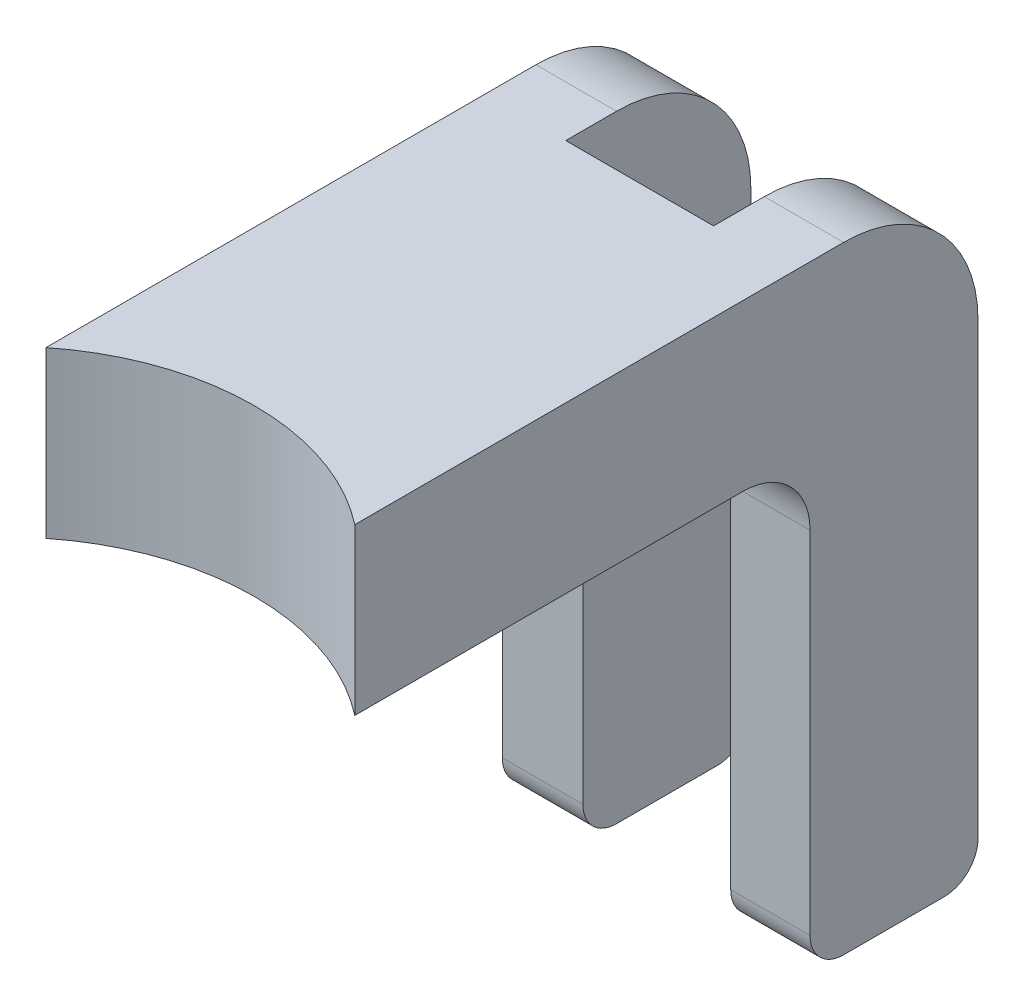
ISO-10303-21;
HEADER;
FILE_DESCRIPTION(('STEP AP214'),'2;1');
FILE_NAME('part.step','',(''),(''),'','','');
FILE_SCHEMA(('AUTOMOTIVE_DESIGN { 1 0 10303 214 1 1 1 1 }'));
ENDSEC;
DATA;
#1=APPLICATION_CONTEXT('core data for automotive mechanical design processes');
#2=APPLICATION_PROTOCOL_DEFINITION('international standard','automotive_design',2000,#1);
#3=PRODUCT_CONTEXT('',#1,'mechanical');
#4=PRODUCT('Part','Part','',(#3));
#5=PRODUCT_RELATED_PRODUCT_CATEGORY('part','',(#4));
#6=PRODUCT_DEFINITION_FORMATION('','',#4);
#7=PRODUCT_DEFINITION_CONTEXT('part definition',#1,'design');
#8=PRODUCT_DEFINITION('design','',#6,#7);
#9=PRODUCT_DEFINITION_SHAPE('','',#8);
#10=(LENGTH_UNIT() NAMED_UNIT(*) SI_UNIT(.MILLI.,.METRE.));
#11=(NAMED_UNIT(*) PLANE_ANGLE_UNIT() SI_UNIT($,.RADIAN.));
#12=(NAMED_UNIT(*) SI_UNIT($,.STERADIAN.) SOLID_ANGLE_UNIT());
#13=UNCERTAINTY_MEASURE_WITH_UNIT(LENGTH_MEASURE(1.E-05),#10,'distance_accuracy_value','');
#14=(GEOMETRIC_REPRESENTATION_CONTEXT(3) GLOBAL_UNCERTAINTY_ASSIGNED_CONTEXT((#13)) GLOBAL_UNIT_ASSIGNED_CONTEXT((#10,
#11,#12)) REPRESENTATION_CONTEXT('',''));
#15=CARTESIAN_POINT('',(0.,0.,0.));
#16=DIRECTION('',(0.,0.,1.));
#17=DIRECTION('',(1.,0.,0.));
#18=AXIS2_PLACEMENT_3D('',#15,#16,#17);
#19=CARTESIAN_POINT('',(43.,0.,-3.68365272160217));
#20=DIRECTION('',(0.,-1.,0.));
#21=DIRECTION('',(0.,0.,-1.));
#22=AXIS2_PLACEMENT_3D('',#19,#20,#21);
#23=PLANE('',#22);
#24=DIRECTION('',(0.,0.,-1.));
#25=VECTOR('',#24,1.);
#26=CARTESIAN_POINT('',(-2.99661212960668,0.,-3.68365272160217));
#27=LINE('',#26,#25);
#28=CARTESIAN_POINT('',(-2.99661212960668,0.,8.78251286461066));
#29=VERTEX_POINT('',#28);
#30=CARTESIAN_POINT('',(-2.99661212960668,0.,-64.1321508343534));
#31=VERTEX_POINT('',#30);
#32=EDGE_CURVE('E44',#29,#31,#27,.T.);
#33=ORIENTED_EDGE('',*,*,#32,.F.);
#34=CARTESIAN_POINT('',(20.0033878782928,0.,37.7652663507207));
#35=DIRECTION('',(0.,-1.,0.));
#36=DIRECTION('',(0.,0.,-1.));
#37=AXIS2_PLACEMENT_3D('',#34,#35,#36);
#38=CIRCLE('',#37,37.);
#39=CARTESIAN_POINT('',(42.8033878703933,0.,8.62491631232517));
#40=VERTEX_POINT('',#39);
#41=EDGE_CURVE('E216',#40,#29,#38,.F.);
#42=ORIENTED_EDGE('',*,*,#41,.F.);
#43=DIRECTION('',(0.,0.,1.));
#44=VECTOR('',#43,1.);
#45=CARTESIAN_POINT('',(42.8033878703933,0.,-3.68365272160217));
#46=LINE('',#45,#44);
#47=CARTESIAN_POINT('',(42.8033878703933,0.,-64.1321508343534));
#48=VERTEX_POINT('',#47);
#49=EDGE_CURVE('E52',#48,#40,#46,.T.);
#50=ORIENTED_EDGE('',*,*,#49,.F.);
#51=DIRECTION('',(-1.,0.,0.));
#52=VECTOR('',#51,1.);
#53=CARTESIAN_POINT('',(43.,0.,-64.1321508343534));
#54=LINE('',#53,#52);
#55=CARTESIAN_POINT('',(31.,0.,-64.1321508343534));
#56=VERTEX_POINT('',#55);
#57=EDGE_CURVE('E180',#48,#56,#54,.T.);
#58=ORIENTED_EDGE('',*,*,#57,.T.);
#59=DIRECTION('',(0.,0.,1.));
#60=VECTOR('',#59,1.);
#61=CARTESIAN_POINT('',(31.,0.,-3.68365272160217));
#62=LINE('',#61,#60);
#63=CARTESIAN_POINT('',(31.,0.,-56.5775329625134));
#64=VERTEX_POINT('',#63);
#65=EDGE_CURVE('E271',#56,#64,#62,.T.);
#66=ORIENTED_EDGE('',*,*,#65,.T.);
#67=DIRECTION('',(-1.,0.,0.));
#68=VECTOR('',#67,1.);
#69=CARTESIAN_POINT('',(43.,0.,-56.5775329625134));
#70=LINE('',#69,#68);
#71=CARTESIAN_POINT('',(9.00000000000001,0.,-56.5775329625134));
#72=VERTEX_POINT('',#71);
#73=EDGE_CURVE('E273',#64,#72,#70,.T.);
#74=ORIENTED_EDGE('',*,*,#73,.T.);
#75=DIRECTION('',(0.,0.,-1.));
#76=VECTOR('',#75,1.);
#77=CARTESIAN_POINT('',(9.00000000000001,0.,-3.68365272160217));
#78=LINE('',#77,#76);
#79=CARTESIAN_POINT('',(9.00000000000001,0.,-64.1321508343534));
#80=VERTEX_POINT('',#79);
#81=EDGE_CURVE('E250',#72,#80,#78,.T.);
#82=ORIENTED_EDGE('',*,*,#81,.T.);
#83=EDGE_CURVE('E182',#80,#31,#54,.T.);
#84=ORIENTED_EDGE('',*,*,#83,.T.);
#85=EDGE_LOOP('',(#33,#42,#50,#58,#66,#74,#82,#84));
#86=FACE_BOUND('',#85,.T.);
#87=ADVANCED_FACE('F31',(#86),#23,.F.);
#88=CARTESIAN_POINT('',(43.,-24.5968877497724,-3.68365272160218));
#89=DIRECTION('',(0.,1.,0.));
#90=DIRECTION('',(0.,0.,1.));
#91=AXIS2_PLACEMENT_3D('',#88,#89,#90);
#92=PLANE('',#91);
#93=DIRECTION('',(0.,0.,1.));
#94=VECTOR('',#93,1.);
#95=CARTESIAN_POINT('',(-2.99661212960668,-24.5968877497724,-3.68365272160218));
#96=LINE('',#95,#94);
#97=CARTESIAN_POINT('',(-2.99661212960667,-24.5968877497724,-49.1321508343534));
#98=VERTEX_POINT('',#97);
#99=CARTESIAN_POINT('',(-2.99661212960668,-24.5968877497724,8.78251286461066));
#100=VERTEX_POINT('',#99);
#101=EDGE_CURVE('E314',#98,#100,#96,.T.);
#102=ORIENTED_EDGE('',*,*,#101,.F.);
#103=DIRECTION('',(-1.,0.,0.));
#104=VECTOR('',#103,1.);
#105=CARTESIAN_POINT('',(43.,-24.5968877497724,-49.1321508343534));
#106=LINE('',#105,#104);
#107=CARTESIAN_POINT('',(42.8033878703933,-24.5968877497724,-49.1321508343534));
#108=VERTEX_POINT('',#107);
#109=EDGE_CURVE('E200',#108,#98,#106,.T.);
#110=ORIENTED_EDGE('',*,*,#109,.F.);
#111=DIRECTION('',(0.,0.,-1.));
#112=VECTOR('',#111,1.);
#113=CARTESIAN_POINT('',(42.8033878703933,-24.5968877497724,-3.68365272160218));
#114=LINE('',#113,#112);
#115=CARTESIAN_POINT('',(42.8033878703933,-24.5968877497724,8.62491631232517));
#116=VERTEX_POINT('',#115);
#117=EDGE_CURVE('E319',#116,#108,#114,.T.);
#118=ORIENTED_EDGE('',*,*,#117,.F.);
#119=CARTESIAN_POINT('',(20.0033878782928,-24.5968877497724,37.7652663507207));
#120=DIRECTION('',(0.,1.,0.));
#121=DIRECTION('',(0.,0.,1.));
#122=AXIS2_PLACEMENT_3D('',#119,#120,#121);
#123=CIRCLE('',#122,37.);
#124=EDGE_CURVE('E210',#100,#116,#123,.F.);
#125=ORIENTED_EDGE('',*,*,#124,.F.);
#126=EDGE_LOOP('',(#102,#110,#118,#125));
#127=FACE_BOUND('',#126,.T.);
#128=ADVANCED_FACE('F356',(#127),#92,.F.);
#129=CARTESIAN_POINT('',(43.,-34.5968877497724,-49.1321508343534));
#130=DIRECTION('',(-1.,0.,0.));
#131=DIRECTION('',(0.,0.,1.));
#132=AXIS2_PLACEMENT_3D('',#129,#130,#131);
#133=CYLINDRICAL_SURFACE('',#132,10.);
#134=CARTESIAN_POINT('',(-2.99661212960667,-34.5968877497724,-49.1321508343534));
#135=DIRECTION('',(-1.,0.,0.));
#136=DIRECTION('',(0.,-1.,0.));
#137=AXIS2_PLACEMENT_3D('',#134,#135,#136);
#138=CIRCLE('',#137,10.);
#139=CARTESIAN_POINT('',(-2.99661212960667,-34.5968877497724,-59.1321508343534));
#140=VERTEX_POINT('',#139);
#141=EDGE_CURVE('E312',#140,#98,#138,.F.);
#142=ORIENTED_EDGE('',*,*,#141,.F.);
#143=DIRECTION('',(-1.,0.,0.));
#144=VECTOR('',#143,1.);
#145=CARTESIAN_POINT('',(43.,-34.5968877497724,-59.1321508343534));
#146=LINE('',#145,#144);
#147=CARTESIAN_POINT('',(9.00000000000001,-34.5968877497724,-59.1321508343534));
#148=VERTEX_POINT('',#147);
#149=EDGE_CURVE('E197',#148,#140,#146,.T.);
#150=ORIENTED_EDGE('',*,*,#149,.F.);
#151=CARTESIAN_POINT('',(9.00000000000001,-34.5968877497724,-49.1321508343534));
#152=DIRECTION('',(-1.,0.,0.));
#153=DIRECTION('',(0.,0.,1.));
#154=AXIS2_PLACEMENT_3D('',#151,#152,#153);
#155=CIRCLE('',#154,10.);
#156=CARTESIAN_POINT('',(9.00000000000001,-27.9210892982255,-56.5775329625134));
#157=VERTEX_POINT('',#156);
#158=EDGE_CURVE('E247',#148,#157,#155,.F.);
#159=ORIENTED_EDGE('',*,*,#158,.T.);
#160=DIRECTION('',(-1.,0.,0.));
#161=VECTOR('',#160,1.);
#162=CARTESIAN_POINT('',(43.,-27.9210892982255,-56.5775329625134));
#163=LINE('',#162,#161);
#164=CARTESIAN_POINT('',(31.,-27.9210892982255,-56.5775329625134));
#165=VERTEX_POINT('',#164);
#166=EDGE_CURVE('E207',#157,#165,#163,.F.);
#167=ORIENTED_EDGE('',*,*,#166,.T.);
#168=CARTESIAN_POINT('',(31.,-34.5968877497724,-49.1321508343534));
#169=DIRECTION('',(1.,0.,0.));
#170=DIRECTION('',(0.,0.,-1.));
#171=AXIS2_PLACEMENT_3D('',#168,#169,#170);
#172=CIRCLE('',#171,10.);
#173=CARTESIAN_POINT('',(31.,-34.5968877497724,-59.1321508343534));
#174=VERTEX_POINT('',#173);
#175=EDGE_CURVE('E268',#165,#174,#172,.F.);
#176=ORIENTED_EDGE('',*,*,#175,.T.);
#177=CARTESIAN_POINT('',(42.8033878703933,-34.5968877497724,-59.1321508343534));
#178=VERTEX_POINT('',#177);
#179=EDGE_CURVE('E198',#178,#174,#146,.T.);
#180=ORIENTED_EDGE('',*,*,#179,.F.);
#181=CARTESIAN_POINT('',(42.8033878703933,-34.5968877497724,-49.1321508343534));
#182=DIRECTION('',(1.,0.,0.));
#183=DIRECTION('',(0.,0.,-1.));
#184=AXIS2_PLACEMENT_3D('',#181,#182,#183);
#185=CIRCLE('',#184,10.);
#186=EDGE_CURVE('E322',#108,#178,#185,.F.);
#187=ORIENTED_EDGE('',*,*,#186,.F.);
#188=ORIENTED_EDGE('',*,*,#109,.T.);
#189=EDGE_LOOP('',(#142,#150,#159,#167,#176,#180,#187,#188));
#190=FACE_BOUND('',#189,.T.);
#191=ADVANCED_FACE('F283',(#190),#133,.F.);
#192=CARTESIAN_POINT('',(20.0033878782928,50.,37.7652663507207));
#193=DIRECTION('',(0.,-1.,0.));
#194=DIRECTION('',(0.,0.,-1.));
#195=AXIS2_PLACEMENT_3D('',#192,#193,#194);
#196=CYLINDRICAL_SURFACE('',#195,37.);
#197=ORIENTED_EDGE('',*,*,#41,.T.);
#198=DIRECTION('',(0.,-1.,0.));
#199=VECTOR('',#198,1.);
#200=CARTESIAN_POINT('',(-2.99661212960668,50.,8.78251286461066));
#201=LINE('',#200,#199);
#202=EDGE_CURVE('E317',#29,#100,#201,.T.);
#203=ORIENTED_EDGE('',*,*,#202,.T.);
#204=ORIENTED_EDGE('',*,*,#124,.T.);
#205=DIRECTION('',(0.,-1.,0.));
#206=VECTOR('',#205,1.);
#207=CARTESIAN_POINT('',(42.8033878703933,50.,8.62491631232517));
#208=LINE('',#207,#206);
#209=EDGE_CURVE('E38',#116,#40,#208,.F.);
#210=ORIENTED_EDGE('',*,*,#209,.T.);
#211=EDGE_LOOP('',(#197,#203,#204,#210));
#212=FACE_BOUND('',#211,.T.);
#213=ADVANCED_FACE('F214',(#212),#196,.F.);
#214=CARTESIAN_POINT('',(43.,-34.5968877497724,-59.1321508343534));
#215=DIRECTION('',(0.,0.,-1.));
#216=DIRECTION('',(0.,1.,0.));
#217=AXIS2_PLACEMENT_3D('',#214,#215,#216);
#218=PLANE('',#217);
#219=DIRECTION('',(0.,1.,0.));
#220=VECTOR('',#219,1.);
#221=CARTESIAN_POINT('',(-2.99661212960667,-34.5968877497724,-59.1321508343534));
#222=LINE('',#221,#220);
#223=CARTESIAN_POINT('',(-2.99661212960666,-86.83159597,-59.1321508343534));
#224=VERTEX_POINT('',#223);
#225=EDGE_CURVE('E292',#224,#140,#222,.T.);
#226=ORIENTED_EDGE('',*,*,#225,.F.);
#227=DIRECTION('',(-1.,0.,0.));
#228=VECTOR('',#227,1.);
#229=CARTESIAN_POINT('',(43.,-86.83159597,-59.1321508343534));
#230=LINE('',#229,#228);
#231=CARTESIAN_POINT('',(9.00000000000001,-86.83159597,-59.1321508343534));
#232=VERTEX_POINT('',#231);
#233=EDGE_CURVE('E194',#232,#224,#230,.T.);
#234=ORIENTED_EDGE('',*,*,#233,.F.);
#235=DIRECTION('',(0.,1.,0.));
#236=VECTOR('',#235,1.);
#237=CARTESIAN_POINT('',(9.00000000000001,-34.5968877497724,-59.1321508343534));
#238=LINE('',#237,#236);
#239=EDGE_CURVE('E244',#232,#148,#238,.T.);
#240=ORIENTED_EDGE('',*,*,#239,.T.);
#241=ORIENTED_EDGE('',*,*,#149,.T.);
#242=EDGE_LOOP('',(#226,#234,#240,#241));
#243=FACE_BOUND('',#242,.T.);
#244=ADVANCED_FACE('F290',(#243),#218,.F.);
#245=CARTESIAN_POINT('',(43.,-86.83159597,-64.1321508343534));
#246=DIRECTION('',(-1.,0.,0.));
#247=DIRECTION('',(0.,0.,1.));
#248=AXIS2_PLACEMENT_3D('',#245,#246,#247);
#249=CYLINDRICAL_SURFACE('',#248,5.00000000000001);
#250=CARTESIAN_POINT('',(-2.99661212960666,-86.83159597,-64.1321508343534));
#251=DIRECTION('',(-1.,0.,0.));
#252=DIRECTION('',(0.,-1.,0.));
#253=AXIS2_PLACEMENT_3D('',#250,#251,#252);
#254=CIRCLE('',#253,5.00000000000001);
#255=CARTESIAN_POINT('',(-2.99661212960666,-91.83159597,-64.1321508343534));
#256=VERTEX_POINT('',#255);
#257=EDGE_CURVE('E297',#256,#224,#254,.T.);
#258=ORIENTED_EDGE('',*,*,#257,.F.);
#259=DIRECTION('',(-1.,0.,0.));
#260=VECTOR('',#259,1.);
#261=CARTESIAN_POINT('',(43.,-91.83159597,-64.1321508343534));
#262=LINE('',#261,#260);
#263=CARTESIAN_POINT('',(9.00000000000001,-91.83159597,-64.1321508343534));
#264=VERTEX_POINT('',#263);
#265=EDGE_CURVE('E191',#264,#256,#262,.T.);
#266=ORIENTED_EDGE('',*,*,#265,.F.);
#267=CARTESIAN_POINT('',(9.00000000000001,-86.83159597,-64.1321508343534));
#268=DIRECTION('',(-1.,0.,0.));
#269=DIRECTION('',(0.,0.,1.));
#270=AXIS2_PLACEMENT_3D('',#267,#268,#269);
#271=CIRCLE('',#270,5.00000000000001);
#272=EDGE_CURVE('E241',#264,#232,#271,.T.);
#273=ORIENTED_EDGE('',*,*,#272,.T.);
#274=ORIENTED_EDGE('',*,*,#233,.T.);
#275=EDGE_LOOP('',(#258,#266,#273,#274));
#276=FACE_BOUND('',#275,.T.);
#277=ADVANCED_FACE('F295',(#276),#249,.T.);
#278=CARTESIAN_POINT('',(43.,-91.83159597,-64.1321508343534));
#279=DIRECTION('',(0.,1.,0.));
#280=DIRECTION('',(0.,0.,1.));
#281=AXIS2_PLACEMENT_3D('',#278,#279,#280);
#282=PLANE('',#281);
#283=DIRECTION('',(0.,0.,1.));
#284=VECTOR('',#283,1.);
#285=CARTESIAN_POINT('',(-2.99661212960666,-91.83159597,-64.1321508343534));
#286=LINE('',#285,#284);
#287=CARTESIAN_POINT('',(-2.99661212960666,-91.83159597,-79.1321508343534));
#288=VERTEX_POINT('',#287);
#289=EDGE_CURVE('E304',#288,#256,#286,.T.);
#290=ORIENTED_EDGE('',*,*,#289,.F.);
#291=DIRECTION('',(-1.,0.,0.));
#292=VECTOR('',#291,1.);
#293=CARTESIAN_POINT('',(43.,-91.83159597,-79.1321508343534));
#294=LINE('',#293,#292);
#295=CARTESIAN_POINT('',(9.,-91.83159597,-79.1321508343534));
#296=VERTEX_POINT('',#295);
#297=EDGE_CURVE('E188',#296,#288,#294,.T.);
#298=ORIENTED_EDGE('',*,*,#297,.F.);
#299=DIRECTION('',(0.,0.,1.));
#300=VECTOR('',#299,1.);
#301=CARTESIAN_POINT('',(9.00000000000001,-91.83159597,-64.1321508343534));
#302=LINE('',#301,#300);
#303=EDGE_CURVE('E238',#296,#264,#302,.T.);
#304=ORIENTED_EDGE('',*,*,#303,.T.);
#305=ORIENTED_EDGE('',*,*,#265,.T.);
#306=EDGE_LOOP('',(#290,#298,#304,#305));
#307=FACE_BOUND('',#306,.T.);
#308=ADVANCED_FACE('F302',(#307),#282,.F.);
#309=CARTESIAN_POINT('',(43.,-86.83159597,-79.1321508343534));
#310=DIRECTION('',(-1.,0.,0.));
#311=DIRECTION('',(0.,0.,1.));
#312=AXIS2_PLACEMENT_3D('',#309,#310,#311);
#313=CYLINDRICAL_SURFACE('',#312,5.00000000000001);
#314=CARTESIAN_POINT('',(-2.99661212960666,-86.83159597,-79.1321508343534));
#315=DIRECTION('',(-1.,0.,0.));
#316=DIRECTION('',(0.,-1.,0.));
#317=AXIS2_PLACEMENT_3D('',#314,#315,#316);
#318=CIRCLE('',#317,5.00000000000001);
#319=CARTESIAN_POINT('',(-2.99661212960666,-86.83159597,-84.1321508343534));
#320=VERTEX_POINT('',#319);
#321=EDGE_CURVE('E174',#320,#288,#318,.T.);
#322=ORIENTED_EDGE('',*,*,#321,.F.);
#323=DIRECTION('',(-1.,0.,0.));
#324=VECTOR('',#323,1.);
#325=CARTESIAN_POINT('',(43.,-86.83159597,-84.1321508343534));
#326=LINE('',#325,#324);
#327=CARTESIAN_POINT('',(9.,-86.83159597,-84.1321508343534));
#328=VERTEX_POINT('',#327);
#329=EDGE_CURVE('E173',#328,#320,#326,.T.);
#330=ORIENTED_EDGE('',*,*,#329,.F.);
#331=CARTESIAN_POINT('',(9.,-86.83159597,-79.1321508343534));
#332=DIRECTION('',(-1.,0.,0.));
#333=DIRECTION('',(0.,0.,1.));
#334=AXIS2_PLACEMENT_3D('',#331,#332,#333);
#335=CIRCLE('',#334,5.00000000000001);
#336=EDGE_CURVE('E235',#328,#296,#335,.T.);
#337=ORIENTED_EDGE('',*,*,#336,.T.);
#338=ORIENTED_EDGE('',*,*,#297,.T.);
#339=EDGE_LOOP('',(#322,#330,#337,#338));
#340=FACE_BOUND('',#339,.T.);
#341=ADVANCED_FACE('F306',(#340),#313,.T.);
#342=CARTESIAN_POINT('',(43.,-86.83159597,-84.1321508343534));
#343=DIRECTION('',(0.,0.,1.));
#344=DIRECTION('',(0.,-1.,0.));
#345=AXIS2_PLACEMENT_3D('',#342,#343,#344);
#346=PLANE('',#345);
#347=DIRECTION('',(0.,-1.,0.));
#348=VECTOR('',#347,1.);
#349=CARTESIAN_POINT('',(-2.99661212960666,-86.83159597,-84.1321508343534));
#350=LINE('',#349,#348);
#351=CARTESIAN_POINT('',(-2.99661212960668,-20.,-84.1321508343534));
#352=VERTEX_POINT('',#351);
#353=EDGE_CURVE('E160',#352,#320,#350,.T.);
#354=ORIENTED_EDGE('',*,*,#353,.F.);
#355=DIRECTION('',(-1.,0.,0.));
#356=VECTOR('',#355,1.);
#357=CARTESIAN_POINT('',(43.,-20.,-84.1321508343533));
#358=LINE('',#357,#356);
#359=CARTESIAN_POINT('',(9.00000000000001,-20.,-84.1321508343533));
#360=VERTEX_POINT('',#359);
#361=EDGE_CURVE('E171',#360,#352,#358,.T.);
#362=ORIENTED_EDGE('',*,*,#361,.F.);
#363=DIRECTION('',(0.,-1.,0.));
#364=VECTOR('',#363,1.);
#365=CARTESIAN_POINT('',(9.,-86.83159597,-84.1321508343534));
#366=LINE('',#365,#364);
#367=EDGE_CURVE('E232',#360,#328,#366,.T.);
#368=ORIENTED_EDGE('',*,*,#367,.T.);
#369=ORIENTED_EDGE('',*,*,#329,.T.);
#370=EDGE_LOOP('',(#354,#362,#368,#369));
#371=FACE_BOUND('',#370,.T.);
#372=ADVANCED_FACE('F169',(#371),#346,.F.);
#373=CARTESIAN_POINT('',(43.,-20.,-64.1321508343534));
#374=DIRECTION('',(-1.,0.,0.));
#375=DIRECTION('',(0.,0.,1.));
#376=AXIS2_PLACEMENT_3D('',#373,#374,#375);
#377=CYLINDRICAL_SURFACE('',#376,20.);
#378=CARTESIAN_POINT('',(-2.99661212960668,-20.,-64.1321508343534));
#379=DIRECTION('',(-1.,0.,0.));
#380=DIRECTION('',(0.,-1.,0.));
#381=AXIS2_PLACEMENT_3D('',#378,#379,#380);
#382=CIRCLE('',#381,20.);
#383=EDGE_CURVE('E11',#31,#352,#382,.T.);
#384=ORIENTED_EDGE('',*,*,#383,.F.);
#385=ORIENTED_EDGE('',*,*,#83,.F.);
#386=CARTESIAN_POINT('',(9.00000000000001,-20.,-64.1321508343534));
#387=DIRECTION('',(-1.,0.,0.));
#388=DIRECTION('',(0.,0.,1.));
#389=AXIS2_PLACEMENT_3D('',#386,#387,#388);
#390=CIRCLE('',#389,20.);
#391=EDGE_CURVE('E178',#80,#360,#390,.T.);
#392=ORIENTED_EDGE('',*,*,#391,.T.);
#393=ORIENTED_EDGE('',*,*,#361,.T.);
#394=EDGE_LOOP('',(#384,#385,#392,#393));
#395=FACE_BOUND('',#394,.T.);
#396=ADVANCED_FACE('F177',(#395),#377,.T.);
#397=DIRECTION('',(0.,-1.,0.));
#398=VECTOR('',#397,1.);
#399=CARTESIAN_POINT('',(42.8033878703933,-34.5968877497724,-59.1321508343534));
#400=LINE('',#399,#398);
#401=CARTESIAN_POINT('',(42.8033878703933,-86.83159597,-59.1321508343534));
#402=VERTEX_POINT('',#401);
#403=EDGE_CURVE('E222',#178,#402,#400,.T.);
#404=ORIENTED_EDGE('',*,*,#403,.F.);
#405=ORIENTED_EDGE('',*,*,#179,.T.);
#406=DIRECTION('',(0.,-1.,0.));
#407=VECTOR('',#406,1.);
#408=CARTESIAN_POINT('',(31.,-34.5968877497724,-59.1321508343534));
#409=LINE('',#408,#407);
#410=CARTESIAN_POINT('',(31.,-86.83159597,-59.1321508343534));
#411=VERTEX_POINT('',#410);
#412=EDGE_CURVE('E265',#174,#411,#409,.T.);
#413=ORIENTED_EDGE('',*,*,#412,.T.);
#414=EDGE_CURVE('E195',#402,#411,#230,.T.);
#415=ORIENTED_EDGE('',*,*,#414,.F.);
#416=EDGE_LOOP('',(#404,#405,#413,#415));
#417=FACE_BOUND('',#416,.T.);
#418=ADVANCED_FACE('F351',(#417),#218,.F.);
#419=CARTESIAN_POINT('',(42.8033878703933,-86.83159597,-64.1321508343534));
#420=DIRECTION('',(1.,0.,0.));
#421=DIRECTION('',(0.,0.,-1.));
#422=AXIS2_PLACEMENT_3D('',#419,#420,#421);
#423=CIRCLE('',#422,5.00000000000001);
#424=CARTESIAN_POINT('',(42.8033878703933,-91.83159597,-64.1321508343534));
#425=VERTEX_POINT('',#424);
#426=EDGE_CURVE('E227',#402,#425,#423,.T.);
#427=ORIENTED_EDGE('',*,*,#426,.F.);
#428=ORIENTED_EDGE('',*,*,#414,.T.);
#429=CARTESIAN_POINT('',(31.,-86.83159597,-64.1321508343534));
#430=DIRECTION('',(1.,0.,0.));
#431=DIRECTION('',(0.,0.,-1.));
#432=AXIS2_PLACEMENT_3D('',#429,#430,#431);
#433=CIRCLE('',#432,5.00000000000001);
#434=CARTESIAN_POINT('',(31.,-91.83159597,-64.1321508343534));
#435=VERTEX_POINT('',#434);
#436=EDGE_CURVE('E262',#411,#435,#433,.T.);
#437=ORIENTED_EDGE('',*,*,#436,.T.);
#438=EDGE_CURVE('E192',#425,#435,#262,.T.);
#439=ORIENTED_EDGE('',*,*,#438,.F.);
#440=EDGE_LOOP('',(#427,#428,#437,#439));
#441=FACE_BOUND('',#440,.T.);
#442=ADVANCED_FACE('F343',(#441),#249,.T.);
#443=DIRECTION('',(0.,0.,-1.));
#444=VECTOR('',#443,1.);
#445=CARTESIAN_POINT('',(42.8033878703933,-91.83159597,-64.1321508343534));
#446=LINE('',#445,#444);
#447=CARTESIAN_POINT('',(42.8033878703933,-91.83159597,-79.1321508343534));
#448=VERTEX_POINT('',#447);
#449=EDGE_CURVE('E330',#425,#448,#446,.T.);
#450=ORIENTED_EDGE('',*,*,#449,.F.);
#451=ORIENTED_EDGE('',*,*,#438,.T.);
#452=DIRECTION('',(0.,0.,-1.));
#453=VECTOR('',#452,1.);
#454=CARTESIAN_POINT('',(31.,-91.83159597,-64.1321508343534));
#455=LINE('',#454,#453);
#456=CARTESIAN_POINT('',(31.,-91.83159597,-79.1321508343534));
#457=VERTEX_POINT('',#456);
#458=EDGE_CURVE('E259',#435,#457,#455,.T.);
#459=ORIENTED_EDGE('',*,*,#458,.T.);
#460=EDGE_CURVE('E189',#448,#457,#294,.T.);
#461=ORIENTED_EDGE('',*,*,#460,.F.);
#462=EDGE_LOOP('',(#450,#451,#459,#461));
#463=FACE_BOUND('',#462,.T.);
#464=ADVANCED_FACE('F341',(#463),#282,.F.);
#465=CARTESIAN_POINT('',(42.8033878703933,-86.83159597,-79.1321508343534));
#466=DIRECTION('',(1.,0.,0.));
#467=DIRECTION('',(0.,0.,-1.));
#468=AXIS2_PLACEMENT_3D('',#465,#466,#467);
#469=CIRCLE('',#468,5.00000000000001);
#470=CARTESIAN_POINT('',(42.8033878703933,-86.83159597,-84.1321508343534));
#471=VERTEX_POINT('',#470);
#472=EDGE_CURVE('E328',#448,#471,#469,.T.);
#473=ORIENTED_EDGE('',*,*,#472,.F.);
#474=ORIENTED_EDGE('',*,*,#460,.T.);
#475=CARTESIAN_POINT('',(31.,-86.83159597,-79.1321508343534));
#476=DIRECTION('',(1.,0.,0.));
#477=DIRECTION('',(0.,0.,-1.));
#478=AXIS2_PLACEMENT_3D('',#475,#476,#477);
#479=CIRCLE('',#478,5.00000000000001);
#480=CARTESIAN_POINT('',(31.,-86.83159597,-84.1321508343534));
#481=VERTEX_POINT('',#480);
#482=EDGE_CURVE('E256',#457,#481,#479,.T.);
#483=ORIENTED_EDGE('',*,*,#482,.T.);
#484=EDGE_CURVE('E186',#471,#481,#326,.T.);
#485=ORIENTED_EDGE('',*,*,#484,.F.);
#486=EDGE_LOOP('',(#473,#474,#483,#485));
#487=FACE_BOUND('',#486,.T.);
#488=ADVANCED_FACE('F372',(#487),#313,.T.);
#489=DIRECTION('',(0.,1.,0.));
#490=VECTOR('',#489,1.);
#491=CARTESIAN_POINT('',(42.8033878703933,-86.83159597,-84.1321508343534));
#492=LINE('',#491,#490);
#493=CARTESIAN_POINT('',(42.8033878703933,-20.,-84.1321508343534));
#494=VERTEX_POINT('',#493);
#495=EDGE_CURVE('E326',#471,#494,#492,.T.);
#496=ORIENTED_EDGE('',*,*,#495,.F.);
#497=ORIENTED_EDGE('',*,*,#484,.T.);
#498=DIRECTION('',(0.,1.,0.));
#499=VECTOR('',#498,1.);
#500=CARTESIAN_POINT('',(31.,-86.83159597,-84.1321508343534));
#501=LINE('',#500,#499);
#502=CARTESIAN_POINT('',(31.,-20.,-84.1321508343534));
#503=VERTEX_POINT('',#502);
#504=EDGE_CURVE('E253',#481,#503,#501,.T.);
#505=ORIENTED_EDGE('',*,*,#504,.T.);
#506=EDGE_CURVE('E179',#494,#503,#358,.T.);
#507=ORIENTED_EDGE('',*,*,#506,.F.);
#508=EDGE_LOOP('',(#496,#497,#505,#507));
#509=FACE_BOUND('',#508,.T.);
#510=ADVANCED_FACE('F375',(#509),#346,.F.);
#511=CARTESIAN_POINT('',(42.8033878703933,-20.,-64.1321508343534));
#512=DIRECTION('',(1.,0.,0.));
#513=DIRECTION('',(0.,0.,-1.));
#514=AXIS2_PLACEMENT_3D('',#511,#512,#513);
#515=CIRCLE('',#514,20.);
#516=EDGE_CURVE('E324',#494,#48,#515,.T.);
#517=ORIENTED_EDGE('',*,*,#516,.F.);
#518=ORIENTED_EDGE('',*,*,#506,.T.);
#519=CARTESIAN_POINT('',(31.,-20.,-64.1321508343534));
#520=DIRECTION('',(1.,0.,0.));
#521=DIRECTION('',(0.,0.,-1.));
#522=AXIS2_PLACEMENT_3D('',#519,#520,#521);
#523=CIRCLE('',#522,20.);
#524=EDGE_CURVE('E204',#503,#56,#523,.T.);
#525=ORIENTED_EDGE('',*,*,#524,.T.);
#526=ORIENTED_EDGE('',*,*,#57,.F.);
#527=EDGE_LOOP('',(#517,#518,#525,#526));
#528=FACE_BOUND('',#527,.T.);
#529=ADVANCED_FACE('F378',(#528),#377,.T.);
#530=CARTESIAN_POINT('',(31.,-115.,-56.5775329625134));
#531=DIRECTION('',(0.,0.,1.));
#532=DIRECTION('',(1.,0.,0.));
#533=AXIS2_PLACEMENT_3D('',#530,#531,#532);
#534=PLANE('',#533);
#535=DIRECTION('',(0.,1.,0.));
#536=VECTOR('',#535,1.);
#537=CARTESIAN_POINT('',(31.,-115.,-56.5775329625134));
#538=LINE('',#537,#536);
#539=EDGE_CURVE('E225',#165,#64,#538,.T.);
#540=ORIENTED_EDGE('',*,*,#539,.F.);
#541=ORIENTED_EDGE('',*,*,#166,.F.);
#542=DIRECTION('',(0.,1.,0.));
#543=VECTOR('',#542,1.);
#544=CARTESIAN_POINT('',(9.00000000000001,-115.,-56.5775329625134));
#545=LINE('',#544,#543);
#546=EDGE_CURVE('E221',#157,#72,#545,.T.);
#547=ORIENTED_EDGE('',*,*,#546,.T.);
#548=ORIENTED_EDGE('',*,*,#73,.F.);
#549=EDGE_LOOP('',(#540,#541,#547,#548));
#550=FACE_BOUND('',#549,.T.);
#551=ADVANCED_FACE('F280',(#550),#534,.F.);
#552=CARTESIAN_POINT('',(31.,-115.,-97.5814420810852));
#553=DIRECTION('',(1.,0.,0.));
#554=DIRECTION('',(0.,0.,-1.));
#555=AXIS2_PLACEMENT_3D('',#552,#553,#554);
#556=PLANE('',#555);
#557=ORIENTED_EDGE('',*,*,#524,.F.);
#558=ORIENTED_EDGE('',*,*,#504,.F.);
#559=ORIENTED_EDGE('',*,*,#482,.F.);
#560=ORIENTED_EDGE('',*,*,#458,.F.);
#561=ORIENTED_EDGE('',*,*,#436,.F.);
#562=ORIENTED_EDGE('',*,*,#412,.F.);
#563=ORIENTED_EDGE('',*,*,#175,.F.);
#564=ORIENTED_EDGE('',*,*,#539,.T.);
#565=ORIENTED_EDGE('',*,*,#65,.F.);
#566=EDGE_LOOP('',(#557,#558,#559,#560,#561,#562,#563,#564,#565));
#567=FACE_BOUND('',#566,.T.);
#568=ADVANCED_FACE('F348',(#567),#556,.F.);
#569=CARTESIAN_POINT('',(9.,-115.,-97.5814420810852));
#570=DIRECTION('',(-1.,0.,0.));
#571=DIRECTION('',(0.,0.,1.));
#572=AXIS2_PLACEMENT_3D('',#569,#570,#571);
#573=PLANE('',#572);
#574=ORIENTED_EDGE('',*,*,#546,.F.);
#575=ORIENTED_EDGE('',*,*,#158,.F.);
#576=ORIENTED_EDGE('',*,*,#239,.F.);
#577=ORIENTED_EDGE('',*,*,#272,.F.);
#578=ORIENTED_EDGE('',*,*,#303,.F.);
#579=ORIENTED_EDGE('',*,*,#336,.F.);
#580=ORIENTED_EDGE('',*,*,#367,.F.);
#581=ORIENTED_EDGE('',*,*,#391,.F.);
#582=ORIENTED_EDGE('',*,*,#81,.F.);
#583=EDGE_LOOP('',(#574,#575,#576,#577,#578,#579,#580,#581,#582));
#584=FACE_BOUND('',#583,.T.);
#585=ADVANCED_FACE('F277',(#584),#573,.F.);
#586=CARTESIAN_POINT('',(42.8033878703933,-113.717870295588,54.1933681597385));
#587=DIRECTION('',(1.,0.,0.));
#588=DIRECTION('',(0.,0.,-1.));
#589=AXIS2_PLACEMENT_3D('',#586,#587,#588);
#590=PLANE('',#589);
#591=ORIENTED_EDGE('',*,*,#403,.T.);
#592=ORIENTED_EDGE('',*,*,#426,.T.);
#593=ORIENTED_EDGE('',*,*,#449,.T.);
#594=ORIENTED_EDGE('',*,*,#472,.T.);
#595=ORIENTED_EDGE('',*,*,#495,.T.);
#596=ORIENTED_EDGE('',*,*,#516,.T.);
#597=ORIENTED_EDGE('',*,*,#49,.T.);
#598=ORIENTED_EDGE('',*,*,#209,.F.);
#599=ORIENTED_EDGE('',*,*,#117,.T.);
#600=ORIENTED_EDGE('',*,*,#186,.T.);
#601=EDGE_LOOP('',(#591,#592,#593,#594,#595,#596,#597,#598,#599,#600));
#602=FACE_BOUND('',#601,.T.);
#603=ADVANCED_FACE('F333',(#602),#590,.T.);
#604=CARTESIAN_POINT('',(-2.99661212960666,-98.100826890601,-109.558531167579));
#605=DIRECTION('',(-1.,0.,0.));
#606=DIRECTION('',(0.,-1.,0.));
#607=AXIS2_PLACEMENT_3D('',#604,#605,#606);
#608=PLANE('',#607);
#609=ORIENTED_EDGE('',*,*,#32,.T.);
#610=ORIENTED_EDGE('',*,*,#383,.T.);
#611=ORIENTED_EDGE('',*,*,#353,.T.);
#612=ORIENTED_EDGE('',*,*,#321,.T.);
#613=ORIENTED_EDGE('',*,*,#289,.T.);
#614=ORIENTED_EDGE('',*,*,#257,.T.);
#615=ORIENTED_EDGE('',*,*,#225,.T.);
#616=ORIENTED_EDGE('',*,*,#141,.T.);
#617=ORIENTED_EDGE('',*,*,#101,.T.);
#618=ORIENTED_EDGE('',*,*,#202,.F.);
#619=EDGE_LOOP('',(#609,#610,#611,#612,#613,#614,#615,#616,#617,#618));
#620=FACE_BOUND('',#619,.T.);
#621=ADVANCED_FACE('F159',(#620),#608,.T.);
#622=CLOSED_SHELL('',(#87,#128,#191,#213,#244,#277,#308,#341,#372,#396,#418,#442,#464,#488,#510,
#529,#551,#568,#585,#603,#621));
#623=MANIFOLD_SOLID_BREP('B2',#622);
#624=ADVANCED_BREP_SHAPE_REPRESENTATION('',(#18,#623),#14);
#625=SHAPE_DEFINITION_REPRESENTATION(#9,#624);
ENDSEC;
END-ISO-10303-21;
